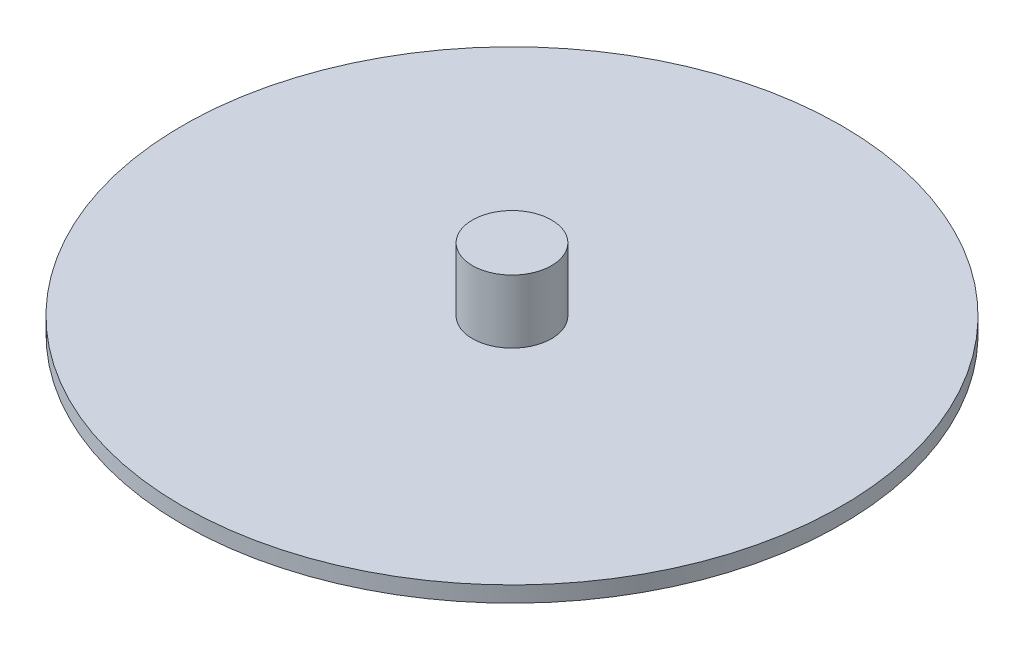
ISO-10303-21;
HEADER;
FILE_DESCRIPTION(('STEP AP214'),'2;1');
FILE_NAME('part.step','',(''),(''),'','','');
FILE_SCHEMA(('AUTOMOTIVE_DESIGN { 1 0 10303 214 1 1 1 1 }'));
ENDSEC;
DATA;
#1=APPLICATION_CONTEXT('core data for automotive mechanical design processes');
#2=APPLICATION_PROTOCOL_DEFINITION('international standard','automotive_design',2000,#1);
#3=PRODUCT_CONTEXT('',#1,'mechanical');
#4=PRODUCT('Part','Part','',(#3));
#5=PRODUCT_RELATED_PRODUCT_CATEGORY('part','',(#4));
#6=PRODUCT_DEFINITION_FORMATION('','',#4);
#7=PRODUCT_DEFINITION_CONTEXT('part definition',#1,'design');
#8=PRODUCT_DEFINITION('design','',#6,#7);
#9=PRODUCT_DEFINITION_SHAPE('','',#8);
#10=(LENGTH_UNIT() NAMED_UNIT(*) SI_UNIT(.MILLI.,.METRE.));
#11=(NAMED_UNIT(*) PLANE_ANGLE_UNIT() SI_UNIT($,.RADIAN.));
#12=(NAMED_UNIT(*) SI_UNIT($,.STERADIAN.) SOLID_ANGLE_UNIT());
#13=UNCERTAINTY_MEASURE_WITH_UNIT(LENGTH_MEASURE(1.E-05),#10,'distance_accuracy_value','');
#14=(GEOMETRIC_REPRESENTATION_CONTEXT(3) GLOBAL_UNCERTAINTY_ASSIGNED_CONTEXT((#13)) GLOBAL_UNIT_ASSIGNED_CONTEXT((#10,
#11,#12)) REPRESENTATION_CONTEXT('',''));
#15=CARTESIAN_POINT('',(0.,0.,0.));
#16=DIRECTION('',(0.,0.,1.));
#17=DIRECTION('',(1.,0.,0.));
#18=AXIS2_PLACEMENT_3D('',#15,#16,#17);
#19=CARTESIAN_POINT('',(0.,0.,0.));
#20=DIRECTION('',(0.,1.,0.));
#21=DIRECTION('',(0.,0.,1.));
#22=AXIS2_PLACEMENT_3D('',#19,#20,#21);
#23=PLANE('',#22);
#24=CARTESIAN_POINT('',(0.,0.,0.));
#25=DIRECTION('',(0.,1.,0.));
#26=DIRECTION('',(0.,0.,1.));
#27=AXIS2_PLACEMENT_3D('',#24,#25,#26);
#28=CIRCLE('',#27,125.);
#29=CARTESIAN_POINT('',(0.,0.,125.));
#30=VERTEX_POINT('',#29);
#31=EDGE_CURVE('E10',#30,#30,#28,.T.);
#32=ORIENTED_EDGE('',*,*,#31,.F.);
#33=EDGE_LOOP('',(#32));
#34=FACE_BOUND('',#33,.T.);
#35=CARTESIAN_POINT('',(0.,0.,-100.));
#36=DIRECTION('',(0.,1.,0.));
#37=DIRECTION('',(0.,0.,1.));
#38=AXIS2_PLACEMENT_3D('',#35,#36,#37);
#39=CIRCLE('',#38,10.);
#40=CARTESIAN_POINT('',(0.,0.,-90.));
#41=VERTEX_POINT('',#40);
#42=EDGE_CURVE('E49',#41,#41,#39,.T.);
#43=ORIENTED_EDGE('',*,*,#42,.T.);
#44=EDGE_LOOP('',(#43));
#45=FACE_BOUND('',#44,.T.);
#46=CARTESIAN_POINT('',(100.,0.,3.49148133884313E-13));
#47=DIRECTION('',(0.,1.,0.));
#48=DIRECTION('',(0.,0.,1.));
#49=AXIS2_PLACEMENT_3D('',#46,#47,#48);
#50=CIRCLE('',#49,10.);
#51=CARTESIAN_POINT('',(100.,0.,10.0000000000003));
#52=VERTEX_POINT('',#51);
#53=EDGE_CURVE('E54',#52,#52,#50,.T.);
#54=ORIENTED_EDGE('',*,*,#53,.T.);
#55=EDGE_LOOP('',(#54));
#56=FACE_BOUND('',#55,.T.);
#57=CARTESIAN_POINT('',(-6.98296267768627E-13,0.,100.));
#58=DIRECTION('',(0.,1.,0.));
#59=DIRECTION('',(0.,0.,1.));
#60=AXIS2_PLACEMENT_3D('',#57,#58,#59);
#61=CIRCLE('',#60,10.);
#62=CARTESIAN_POINT('',(-6.98296267768627E-13,0.,110.));
#63=VERTEX_POINT('',#62);
#64=EDGE_CURVE('E59',#63,#63,#61,.T.);
#65=ORIENTED_EDGE('',*,*,#64,.T.);
#66=EDGE_LOOP('',(#65));
#67=FACE_BOUND('',#66,.T.);
#68=CARTESIAN_POINT('',(-100.,0.,-1.04744440165294E-12));
#69=DIRECTION('',(0.,1.,0.));
#70=DIRECTION('',(0.,0.,1.));
#71=AXIS2_PLACEMENT_3D('',#68,#69,#70);
#72=CIRCLE('',#71,10.);
#73=CARTESIAN_POINT('',(-100.,0.,9.99999999999895));
#74=VERTEX_POINT('',#73);
#75=EDGE_CURVE('E75',#74,#74,#72,.T.);
#76=ORIENTED_EDGE('',*,*,#75,.T.);
#77=EDGE_LOOP('',(#76));
#78=FACE_BOUND('',#77,.T.);
#79=ADVANCED_FACE('F41',(#34,#45,#56,#67,#78),#23,.F.);
#80=CARTESIAN_POINT('',(0.,3.,0.));
#81=DIRECTION('',(0.,-1.,0.));
#82=DIRECTION('',(0.,0.,-1.));
#83=AXIS2_PLACEMENT_3D('',#80,#81,#82);
#84=CYLINDRICAL_SURFACE('',#83,125.);
#85=ORIENTED_EDGE('',*,*,#31,.T.);
#86=EDGE_LOOP('',(#85));
#87=FACE_BOUND('',#86,.T.);
#88=CARTESIAN_POINT('',(0.,6.,0.));
#89=DIRECTION('',(0.,1.,0.));
#90=DIRECTION('',(0.,0.,1.));
#91=AXIS2_PLACEMENT_3D('',#88,#89,#90);
#92=CIRCLE('',#91,125.);
#93=CARTESIAN_POINT('',(0.,6.,125.));
#94=VERTEX_POINT('',#93);
#95=EDGE_CURVE('E85',#94,#94,#92,.T.);
#96=ORIENTED_EDGE('',*,*,#95,.F.);
#97=EDGE_LOOP('',(#96));
#98=FACE_BOUND('',#97,.T.);
#99=ADVANCED_FACE('F43',(#87,#98),#84,.T.);
#100=CARTESIAN_POINT('',(0.,3.,-100.));
#101=DIRECTION('',(0.,-1.,0.));
#102=DIRECTION('',(0.,0.,-1.));
#103=AXIS2_PLACEMENT_3D('',#100,#101,#102);
#104=CYLINDRICAL_SURFACE('',#103,10.);
#105=CARTESIAN_POINT('',(0.,3.,-100.));
#106=DIRECTION('',(0.,1.,0.));
#107=DIRECTION('',(0.,0.,1.));
#108=AXIS2_PLACEMENT_3D('',#105,#106,#107);
#109=CIRCLE('',#108,10.);
#110=CARTESIAN_POINT('',(0.,3.,-90.));
#111=VERTEX_POINT('',#110);
#112=EDGE_CURVE('E62',#111,#111,#109,.T.);
#113=ORIENTED_EDGE('',*,*,#112,.T.);
#114=EDGE_LOOP('',(#113));
#115=FACE_BOUND('',#114,.T.);
#116=ORIENTED_EDGE('',*,*,#42,.F.);
#117=EDGE_LOOP('',(#116));
#118=FACE_BOUND('',#117,.T.);
#119=ADVANCED_FACE('F114',(#115,#118),#104,.F.);
#120=CARTESIAN_POINT('',(100.,3.,3.49148133884313E-13));
#121=DIRECTION('',(0.,-1.,0.));
#122=DIRECTION('',(0.,0.,-1.));
#123=AXIS2_PLACEMENT_3D('',#120,#121,#122);
#124=CYLINDRICAL_SURFACE('',#123,10.);
#125=CARTESIAN_POINT('',(100.,3.,3.49148133884313E-13));
#126=DIRECTION('',(0.,1.,0.));
#127=DIRECTION('',(0.,0.,1.));
#128=AXIS2_PLACEMENT_3D('',#125,#126,#127);
#129=CIRCLE('',#128,10.);
#130=CARTESIAN_POINT('',(100.,3.,10.0000000000003));
#131=VERTEX_POINT('',#130);
#132=EDGE_CURVE('E66',#131,#131,#129,.T.);
#133=ORIENTED_EDGE('',*,*,#132,.T.);
#134=EDGE_LOOP('',(#133));
#135=FACE_BOUND('',#134,.T.);
#136=ORIENTED_EDGE('',*,*,#53,.F.);
#137=EDGE_LOOP('',(#136));
#138=FACE_BOUND('',#137,.T.);
#139=ADVANCED_FACE('F119',(#135,#138),#124,.F.);
#140=CARTESIAN_POINT('',(-6.98296267768627E-13,3.,100.));
#141=DIRECTION('',(0.,-1.,0.));
#142=DIRECTION('',(0.,0.,-1.));
#143=AXIS2_PLACEMENT_3D('',#140,#141,#142);
#144=CYLINDRICAL_SURFACE('',#143,10.);
#145=CARTESIAN_POINT('',(-6.98296267768627E-13,3.,100.));
#146=DIRECTION('',(0.,1.,0.));
#147=DIRECTION('',(0.,0.,1.));
#148=AXIS2_PLACEMENT_3D('',#145,#146,#147);
#149=CIRCLE('',#148,10.);
#150=CARTESIAN_POINT('',(-6.98296267768627E-13,3.,110.));
#151=VERTEX_POINT('',#150);
#152=EDGE_CURVE('E65',#151,#151,#149,.T.);
#153=ORIENTED_EDGE('',*,*,#152,.T.);
#154=EDGE_LOOP('',(#153));
#155=FACE_BOUND('',#154,.T.);
#156=ORIENTED_EDGE('',*,*,#64,.F.);
#157=EDGE_LOOP('',(#156));
#158=FACE_BOUND('',#157,.T.);
#159=ADVANCED_FACE('F128',(#155,#158),#144,.F.);
#160=CARTESIAN_POINT('',(-100.,3.,-1.04744440165294E-12));
#161=DIRECTION('',(0.,-1.,0.));
#162=DIRECTION('',(0.,0.,-1.));
#163=AXIS2_PLACEMENT_3D('',#160,#161,#162);
#164=CYLINDRICAL_SURFACE('',#163,10.);
#165=CARTESIAN_POINT('',(-100.,3.,-1.04744440165294E-12));
#166=DIRECTION('',(0.,1.,0.));
#167=DIRECTION('',(0.,0.,1.));
#168=AXIS2_PLACEMENT_3D('',#165,#166,#167);
#169=CIRCLE('',#168,10.);
#170=CARTESIAN_POINT('',(-100.,3.,9.99999999999895));
#171=VERTEX_POINT('',#170);
#172=EDGE_CURVE('E71',#171,#171,#169,.T.);
#173=ORIENTED_EDGE('',*,*,#172,.T.);
#174=EDGE_LOOP('',(#173));
#175=FACE_BOUND('',#174,.T.);
#176=ORIENTED_EDGE('',*,*,#75,.F.);
#177=EDGE_LOOP('',(#176));
#178=FACE_BOUND('',#177,.T.);
#179=ADVANCED_FACE('F132',(#175,#178),#164,.F.);
#180=CARTESIAN_POINT('',(0.,3.,0.));
#181=DIRECTION('',(0.,1.,0.));
#182=DIRECTION('',(0.,0.,1.));
#183=AXIS2_PLACEMENT_3D('',#180,#181,#182);
#184=PLANE('',#183);
#185=ORIENTED_EDGE('',*,*,#172,.F.);
#186=EDGE_LOOP('',(#185));
#187=FACE_BOUND('',#186,.T.);
#188=ADVANCED_FACE('F136',(#187),#184,.F.);
#189=ORIENTED_EDGE('',*,*,#132,.F.);
#190=EDGE_LOOP('',(#189));
#191=FACE_BOUND('',#190,.T.);
#192=ADVANCED_FACE('F163',(#191),#184,.F.);
#193=ORIENTED_EDGE('',*,*,#112,.F.);
#194=EDGE_LOOP('',(#193));
#195=FACE_BOUND('',#194,.T.);
#196=ADVANCED_FACE('F139',(#195),#184,.F.);
#197=ORIENTED_EDGE('',*,*,#152,.F.);
#198=EDGE_LOOP('',(#197));
#199=FACE_BOUND('',#198,.T.);
#200=ADVANCED_FACE('F109',(#199),#184,.F.);
#201=CARTESIAN_POINT('',(0.,6.,0.));
#202=DIRECTION('',(0.,1.,0.));
#203=DIRECTION('',(0.,0.,1.));
#204=AXIS2_PLACEMENT_3D('',#201,#202,#203);
#205=PLANE('',#204);
#206=CARTESIAN_POINT('',(0.,6.,0.));
#207=DIRECTION('',(0.,1.,0.));
#208=DIRECTION('',(0.,0.,1.));
#209=AXIS2_PLACEMENT_3D('',#206,#207,#208);
#210=CIRCLE('',#209,15.);
#211=CARTESIAN_POINT('',(0.,6.,15.));
#212=VERTEX_POINT('',#211);
#213=EDGE_CURVE('E90',#212,#212,#210,.T.);
#214=ORIENTED_EDGE('',*,*,#213,.F.);
#215=EDGE_LOOP('',(#214));
#216=FACE_BOUND('',#215,.T.);
#217=ORIENTED_EDGE('',*,*,#95,.T.);
#218=EDGE_LOOP('',(#217));
#219=FACE_BOUND('',#218,.T.);
#220=ADVANCED_FACE('F103',(#216,#219),#205,.T.);
#221=CARTESIAN_POINT('',(0.,30.,0.));
#222=DIRECTION('',(0.,-1.,0.));
#223=DIRECTION('',(0.,0.,-1.));
#224=AXIS2_PLACEMENT_3D('',#221,#222,#223);
#225=CYLINDRICAL_SURFACE('',#224,15.);
#226=CARTESIAN_POINT('',(0.,30.,0.));
#227=DIRECTION('',(0.,1.,0.));
#228=DIRECTION('',(0.,0.,1.));
#229=AXIS2_PLACEMENT_3D('',#226,#227,#228);
#230=CIRCLE('',#229,15.);
#231=CARTESIAN_POINT('',(0.,30.,15.));
#232=VERTEX_POINT('',#231);
#233=EDGE_CURVE('E89',#232,#232,#230,.T.);
#234=ORIENTED_EDGE('',*,*,#233,.F.);
#235=EDGE_LOOP('',(#234));
#236=FACE_BOUND('',#235,.T.);
#237=ORIENTED_EDGE('',*,*,#213,.T.);
#238=EDGE_LOOP('',(#237));
#239=FACE_BOUND('',#238,.T.);
#240=ADVANCED_FACE('F100',(#236,#239),#225,.T.);
#241=CARTESIAN_POINT('',(0.,30.,0.));
#242=DIRECTION('',(0.,1.,0.));
#243=DIRECTION('',(0.,0.,1.));
#244=AXIS2_PLACEMENT_3D('',#241,#242,#243);
#245=PLANE('',#244);
#246=ORIENTED_EDGE('',*,*,#233,.T.);
#247=EDGE_LOOP('',(#246));
#248=FACE_BOUND('',#247,.T.);
#249=ADVANCED_FACE('F98',(#248),#245,.T.);
#250=CLOSED_SHELL('',(#79,#99,#119,#139,#159,#179,#188,#192,#196,#200,#220,#240,#249));
#251=MANIFOLD_SOLID_BREP('B2',#250);
#252=ADVANCED_BREP_SHAPE_REPRESENTATION('',(#18,#251),#14);
#253=SHAPE_DEFINITION_REPRESENTATION(#9,#252);
ENDSEC;
END-ISO-10303-21;
